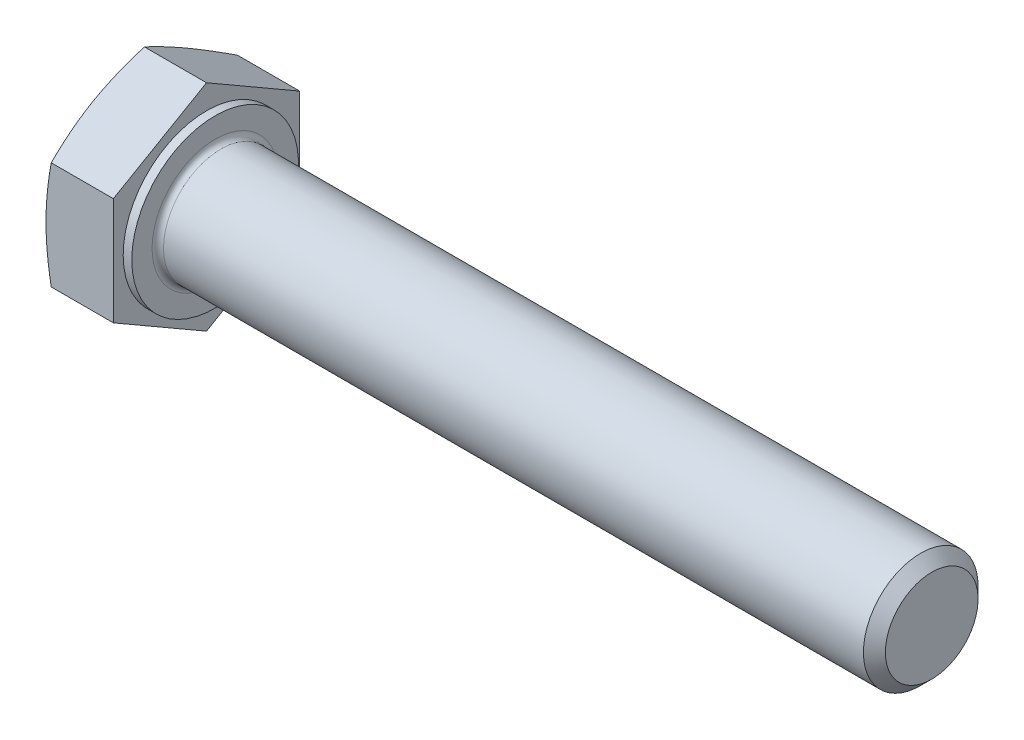
ISO-10303-21;
HEADER;
FILE_DESCRIPTION(('STEP AP214'),'2;1');
FILE_NAME('part.step','',(''),(''),'','','');
FILE_SCHEMA(('AUTOMOTIVE_DESIGN { 1 0 10303 214 1 1 1 1 }'));
ENDSEC;
DATA;
#1=APPLICATION_CONTEXT('core data for automotive mechanical design processes');
#2=APPLICATION_PROTOCOL_DEFINITION('international standard','automotive_design',2000,#1);
#3=PRODUCT_CONTEXT('',#1,'mechanical');
#4=PRODUCT('Part','Part','',(#3));
#5=PRODUCT_RELATED_PRODUCT_CATEGORY('part','',(#4));
#6=PRODUCT_DEFINITION_FORMATION('','',#4);
#7=PRODUCT_DEFINITION_CONTEXT('part definition',#1,'design');
#8=PRODUCT_DEFINITION('design','',#6,#7);
#9=PRODUCT_DEFINITION_SHAPE('','',#8);
#10=(LENGTH_UNIT() NAMED_UNIT(*) SI_UNIT(.MILLI.,.METRE.));
#11=(NAMED_UNIT(*) PLANE_ANGLE_UNIT() SI_UNIT($,.RADIAN.));
#12=(NAMED_UNIT(*) SI_UNIT($,.STERADIAN.) SOLID_ANGLE_UNIT());
#13=UNCERTAINTY_MEASURE_WITH_UNIT(LENGTH_MEASURE(1.E-05),#10,'distance_accuracy_value','');
#14=(GEOMETRIC_REPRESENTATION_CONTEXT(3) GLOBAL_UNCERTAINTY_ASSIGNED_CONTEXT((#13)) GLOBAL_UNIT_ASSIGNED_CONTEXT((#10,
#11,#12)) REPRESENTATION_CONTEXT('',''));
#15=CARTESIAN_POINT('',(0.,0.,0.));
#16=DIRECTION('',(0.,0.,1.));
#17=DIRECTION('',(1.,0.,0.));
#18=AXIS2_PLACEMENT_3D('',#15,#16,#17);
#19=CARTESIAN_POINT('',(-5.3,3.25,0.));
#20=DIRECTION('',(-1.,0.,0.));
#21=DIRECTION('',(0.,0.,1.));
#22=AXIS2_PLACEMENT_3D('',#19,#20,#21);
#23=PLANE('',#22);
#24=CARTESIAN_POINT('',(-5.30000000000191,0.,0.));
#25=DIRECTION('',(1.,0.,0.));
#26=DIRECTION('',(0.,0.,-1.));
#27=AXIS2_PLACEMENT_3D('',#24,#25,#26);
#28=CIRCLE('',#27,6.5000000000007);
#29=CARTESIAN_POINT('',(-5.30000000000204,0.,6.50000000000035));
#30=VERTEX_POINT('',#29);
#31=CARTESIAN_POINT('',(-5.30000000000204,-5.62916512459915,3.25000000000018));
#32=VERTEX_POINT('',#31);
#33=EDGE_CURVE('E90',#30,#32,#28,.T.);
#34=ORIENTED_EDGE('',*,*,#33,.F.);
#35=CARTESIAN_POINT('',(-5.30000000000191,0.,0.));
#36=DIRECTION('',(1.,0.,0.));
#37=DIRECTION('',(0.,0.,-1.));
#38=AXIS2_PLACEMENT_3D('',#35,#36,#37);
#39=CIRCLE('',#38,6.5000000000007);
#40=CARTESIAN_POINT('',(-5.30000000000204,5.62916512459915,3.25000000000017));
#41=VERTEX_POINT('',#40);
#42=EDGE_CURVE('E87',#41,#30,#39,.T.);
#43=ORIENTED_EDGE('',*,*,#42,.F.);
#44=CARTESIAN_POINT('',(-5.30000000000191,0.,0.));
#45=DIRECTION('',(1.,0.,0.));
#46=DIRECTION('',(0.,0.,-1.));
#47=AXIS2_PLACEMENT_3D('',#44,#45,#46);
#48=CIRCLE('',#47,6.5000000000007);
#49=CARTESIAN_POINT('',(-5.30000000000204,5.62916512459915,-3.25000000000018));
#50=VERTEX_POINT('',#49);
#51=EDGE_CURVE('E19',#50,#41,#48,.T.);
#52=ORIENTED_EDGE('',*,*,#51,.F.);
#53=CARTESIAN_POINT('',(-5.30000000000191,0.,0.));
#54=DIRECTION('',(1.,0.,0.));
#55=DIRECTION('',(0.,0.,-1.));
#56=AXIS2_PLACEMENT_3D('',#53,#54,#55);
#57=CIRCLE('',#56,6.5000000000007);
#58=CARTESIAN_POINT('',(-5.30000000000204,0.,-6.50000000000035));
#59=VERTEX_POINT('',#58);
#60=EDGE_CURVE('E494',#59,#50,#57,.T.);
#61=ORIENTED_EDGE('',*,*,#60,.F.);
#62=CARTESIAN_POINT('',(-5.30000000000191,0.,0.));
#63=DIRECTION('',(1.,0.,0.));
#64=DIRECTION('',(0.,0.,-1.));
#65=AXIS2_PLACEMENT_3D('',#62,#63,#64);
#66=CIRCLE('',#65,6.5000000000007);
#67=CARTESIAN_POINT('',(-5.30000000000204,-5.62916512459915,-3.25000000000017));
#68=VERTEX_POINT('',#67);
#69=EDGE_CURVE('E143',#68,#59,#66,.T.);
#70=ORIENTED_EDGE('',*,*,#69,.F.);
#71=CARTESIAN_POINT('',(-5.30000000000191,0.,0.));
#72=DIRECTION('',(1.,0.,0.));
#73=DIRECTION('',(0.,0.,-1.));
#74=AXIS2_PLACEMENT_3D('',#71,#72,#73);
#75=CIRCLE('',#74,6.5000000000007);
#76=EDGE_CURVE('E497',#32,#68,#75,.T.);
#77=ORIENTED_EDGE('',*,*,#76,.F.);
#78=EDGE_LOOP('',(#34,#43,#52,#61,#70,#77));
#79=FACE_BOUND('',#78,.T.);
#80=ADVANCED_FACE('F16',(#79),#23,.T.);
#81=CARTESIAN_POINT('',(-4.93181250797808,0.,0.));
#82=DIRECTION('',(1.,0.,0.));
#83=DIRECTION('',(0.,0.,-1.));
#84=AXIS2_PLACEMENT_3D('',#81,#82,#83);
#85=CONICAL_SURFACE('',#84,7.51158682046273,1.22173047639633);
#86=CARTESIAN_POINT('',(-4.9340084572349,7.50555349946536,3.81149567973056E-13));
#87=CARTESIAN_POINT('',(-4.99040133721858,7.35068182366044,-0.268245611147067));
#88=CARTESIAN_POINT('',(-5.04171341612011,7.1952901203805,-0.537391936302592));
#89=CARTESIAN_POINT('',(-5.13191353618944,6.88394451050351,-1.07665835132306));
#90=CARTESIAN_POINT('',(-5.17082716885483,6.72799244275547,-1.34677525620808));
#91=CARTESIAN_POINT('',(-5.21838013111644,6.493477197218,-1.75296757662848));
#92=CARTESIAN_POINT('',(-5.23243042665346,6.41518736692452,-1.88856954041273));
#93=CARTESIAN_POINT('',(-5.25670291998448,6.25845889501086,-2.16003121675981));
#94=CARTESIAN_POINT('',(-5.26692514592552,6.18002025448912,-2.2958909274201));
#95=CARTESIAN_POINT('',(-5.28337651284228,6.02287555891266,-2.56807352429847));
#96=CARTESIAN_POINT('',(-5.28959737705544,5.9441692859519,-2.7043967879409));
#97=CARTESIAN_POINT('',(-5.2979158402048,5.78669746743397,-2.97714597837422));
#98=CARTESIAN_POINT('',(-5.30001317614019,5.70793191841664,-3.11357191115829));
#99=CARTESIAN_POINT('',(-5.30000000000216,5.62916512459885,-3.25));
#100=B_SPLINE_CURVE_WITH_KNOTS('',3,(#86,#87,#88,#89,#90,#91,#92,#93,#94,#95,#96,#97,#98,#99),
.UNSPECIFIED.,.F.,.F.,(4,2,2,2,2,2,4),(0.,0.944644564579949,1.88732647361753,2.35891022619085,
2.8304905112329,3.3030431431734,3.77562591379344),.UNSPECIFIED.);
#101=CARTESIAN_POINT('',(-4.9340084572349,7.50555349946536,0.));
#102=VERTEX_POINT('',#101);
#103=EDGE_CURVE('E107',#102,#50,#100,.T.);
#104=ORIENTED_EDGE('',*,*,#103,.T.);
#105=ORIENTED_EDGE('',*,*,#51,.T.);
#106=CARTESIAN_POINT('',(-5.30000000000216,5.62916512459885,3.25));
#107=CARTESIAN_POINT('',(-5.30001317614019,5.70793191841664,3.11357191115829));
#108=CARTESIAN_POINT('',(-5.2979158402048,5.78669746743397,2.97714597837422));
#109=CARTESIAN_POINT('',(-5.28959737705544,5.9441692859519,2.7043967879409));
#110=CARTESIAN_POINT('',(-5.28337651284228,6.02287555891266,2.56807352429847));
#111=CARTESIAN_POINT('',(-5.26692514592552,6.18002025448912,2.2958909274201));
#112=CARTESIAN_POINT('',(-5.25670291998448,6.25845889501086,2.16003121675981));
#113=CARTESIAN_POINT('',(-5.23243042665346,6.41518736692452,1.88856954041273));
#114=CARTESIAN_POINT('',(-5.21838013111644,6.493477197218,1.75296757662847));
#115=CARTESIAN_POINT('',(-5.17082716885482,6.72799244275547,1.34677525620808));
#116=CARTESIAN_POINT('',(-5.13191353618944,6.88394451050351,1.07665835132306));
#117=CARTESIAN_POINT('',(-5.04171341612011,7.1952901203805,0.537391936302591));
#118=CARTESIAN_POINT('',(-4.99040133721858,7.35068182366044,0.268245611147065));
#119=CARTESIAN_POINT('',(-4.93400845723489,7.50555349946536,-3.822709621276E-13));
#120=B_SPLINE_CURVE_WITH_KNOTS('',3,(#106,#107,#108,#109,#110,#111,#112,#113,#114,#115,#116,
#117,#118,#119),.UNSPECIFIED.,.F.,.F.,(4,2,2,2,2,2,4),(0.,0.472582770620044,0.945135402560547,
1.4167156876026,1.88829944017592,2.83098134921349,3.77562591379344),.UNSPECIFIED.);
#121=EDGE_CURVE('E101',#41,#102,#120,.T.);
#122=ORIENTED_EDGE('',*,*,#121,.T.);
#123=EDGE_LOOP('',(#104,#105,#122));
#124=FACE_BOUND('',#123,.T.);
#125=ADVANCED_FACE('F105',(#124),#85,.T.);
#126=CARTESIAN_POINT('',(-4.93181250797808,0.,0.));
#127=DIRECTION('',(1.,0.,0.));
#128=DIRECTION('',(0.,0.,-1.));
#129=AXIS2_PLACEMENT_3D('',#126,#127,#128);
#130=CONICAL_SURFACE('',#129,7.51158682046273,1.22173047639633);
#131=CARTESIAN_POINT('',(-4.9340084572349,3.75277674973235,6.50000000000038));
#132=CARTESIAN_POINT('',(-4.99040133721858,3.90764842553726,6.23175438885293));
#133=CARTESIAN_POINT('',(-5.04171341612011,4.0630401288172,5.96260806369741));
#134=CARTESIAN_POINT('',(-5.13191353618944,4.37438573869419,5.42334164867694));
#135=CARTESIAN_POINT('',(-5.17082716885482,4.53033780644223,5.15322474379192));
#136=CARTESIAN_POINT('',(-5.21838013111644,4.7648530519797,4.74703242337153));
#137=CARTESIAN_POINT('',(-5.23243042665346,4.84314288227318,4.61143045958727));
#138=CARTESIAN_POINT('',(-5.25670291998448,4.99987135418684,4.33996878324019));
#139=CARTESIAN_POINT('',(-5.26692514592552,5.07830999470858,4.2041090725799));
#140=CARTESIAN_POINT('',(-5.28337651284228,5.23545469028504,3.93192647570153));
#141=CARTESIAN_POINT('',(-5.28959737705544,5.31416096324581,3.7956032120591));
#142=CARTESIAN_POINT('',(-5.2979158402048,5.47163278176374,3.52285402162578));
#143=CARTESIAN_POINT('',(-5.30001317614019,5.55039833078107,3.38642808884171));
#144=CARTESIAN_POINT('',(-5.30000000000216,5.62916512459885,3.25));
#145=B_SPLINE_CURVE_WITH_KNOTS('',3,(#131,#132,#133,#134,#135,#136,#137,#138,#139,#140,#141,
#142,#143,#144),.UNSPECIFIED.,.F.,.F.,(4,2,2,2,2,2,4),(0.,0.944644564579949,1.88732647361753,
2.35891022619085,2.8304905112329,3.3030431431734,3.77562591379344),.UNSPECIFIED.);
#146=CARTESIAN_POINT('',(-4.9340084572349,3.75277674973268,6.50000000000019));
#147=VERTEX_POINT('',#146);
#148=EDGE_CURVE('E95',#147,#41,#145,.T.);
#149=ORIENTED_EDGE('',*,*,#148,.T.);
#150=ORIENTED_EDGE('',*,*,#42,.T.);
#151=CARTESIAN_POINT('',(-5.30000000000216,0.,6.5));
#152=CARTESIAN_POINT('',(-5.30001317614019,0.157533587635573,6.5));
#153=CARTESIAN_POINT('',(-5.2979158402048,0.315064685670232,6.5));
#154=CARTESIAN_POINT('',(-5.28959737705544,0.630008322706093,6.5));
#155=CARTESIAN_POINT('',(-5.28337651284228,0.787420868627619,6.5));
#156=CARTESIAN_POINT('',(-5.26692514592552,1.10171025978054,6.5));
#157=CARTESIAN_POINT('',(-5.25670291998448,1.25858754082402,6.5));
#158=CARTESIAN_POINT('',(-5.23243042665346,1.57204448465133,6.5));
#159=CARTESIAN_POINT('',(-5.21838013111644,1.7286241452383,6.5));
#160=CARTESIAN_POINT('',(-5.17082716885482,2.19765463631324,6.5));
#161=CARTESIAN_POINT('',(-5.13191353618944,2.50955877180931,6.5));
#162=CARTESIAN_POINT('',(-5.04171341612011,3.1322499915633,6.5));
#163=CARTESIAN_POINT('',(-4.99040133721858,3.44303339812318,6.5));
#164=CARTESIAN_POINT('',(-4.9340084572349,3.75277674973301,6.5));
#165=B_SPLINE_CURVE_WITH_KNOTS('',3,(#151,#152,#153,#154,#155,#156,#157,#158,#159,#160,#161,
#162,#163,#164),.UNSPECIFIED.,.F.,.F.,(4,2,2,2,2,2,4),(0.,0.472582770620044,0.945135402560546,
1.4167156876026,1.88829944017592,2.83098134921349,3.77562591379344),.UNSPECIFIED.);
#166=EDGE_CURVE('E97',#30,#147,#165,.T.);
#167=ORIENTED_EDGE('',*,*,#166,.T.);
#168=EDGE_LOOP('',(#149,#150,#167));
#169=FACE_BOUND('',#168,.T.);
#170=ADVANCED_FACE('F96',(#169),#130,.T.);
#171=CARTESIAN_POINT('',(-4.93181250797808,0.,0.));
#172=DIRECTION('',(1.,0.,0.));
#173=DIRECTION('',(0.,0.,-1.));
#174=AXIS2_PLACEMENT_3D('',#171,#172,#173);
#175=CONICAL_SURFACE('',#174,7.51158682046273,1.22173047639633);
#176=CARTESIAN_POINT('',(-4.9340084572349,-3.75277674973301,6.5));
#177=CARTESIAN_POINT('',(-4.99040133721858,-3.44303339812318,6.5));
#178=CARTESIAN_POINT('',(-5.04171341612012,-3.13224999156329,6.5));
#179=CARTESIAN_POINT('',(-5.13191353618944,-2.50955877180931,6.5));
#180=CARTESIAN_POINT('',(-5.17082716885482,-2.19765463631324,6.5));
#181=CARTESIAN_POINT('',(-5.21838013111644,-1.7286241452383,6.5));
#182=CARTESIAN_POINT('',(-5.23243042665346,-1.57204448465133,6.5));
#183=CARTESIAN_POINT('',(-5.25670291998448,-1.25858754082402,6.5));
#184=CARTESIAN_POINT('',(-5.26692514592552,-1.10171025978054,6.5));
#185=CARTESIAN_POINT('',(-5.28337651284228,-0.787420868627618,6.5));
#186=CARTESIAN_POINT('',(-5.28959737705544,-0.630008322706092,6.5));
#187=CARTESIAN_POINT('',(-5.2979158402048,-0.315064685670231,6.5));
#188=CARTESIAN_POINT('',(-5.30001317614019,-0.157533587635572,6.5));
#189=CARTESIAN_POINT('',(-5.30000000000216,0.,6.5));
#190=B_SPLINE_CURVE_WITH_KNOTS('',3,(#176,#177,#178,#179,#180,#181,#182,#183,#184,#185,#186,
#187,#188,#189),.UNSPECIFIED.,.F.,.F.,(4,2,2,2,2,2,4),(0.,0.944644564579949,1.88732647361753,
2.35891022619085,2.8304905112329,3.3030431431734,3.77562591379344),.UNSPECIFIED.);
#191=CARTESIAN_POINT('',(-4.9340084572349,-3.75277674973268,6.50000000000019));
#192=VERTEX_POINT('',#191);
#193=EDGE_CURVE('E114',#192,#30,#190,.T.);
#194=ORIENTED_EDGE('',*,*,#193,.T.);
#195=ORIENTED_EDGE('',*,*,#33,.T.);
#196=CARTESIAN_POINT('',(-5.30000000000216,-5.62916512459885,3.25));
#197=CARTESIAN_POINT('',(-5.30001317614019,-5.55039833078106,3.38642808884171));
#198=CARTESIAN_POINT('',(-5.2979158402048,-5.47163278176373,3.52285402162578));
#199=CARTESIAN_POINT('',(-5.28959737705544,-5.3141609632458,3.7956032120591));
#200=CARTESIAN_POINT('',(-5.28337651284228,-5.23545469028504,3.93192647570153));
#201=CARTESIAN_POINT('',(-5.26692514592552,-5.07830999470858,4.2041090725799));
#202=CARTESIAN_POINT('',(-5.25670291998448,-4.99987135418684,4.33996878324019));
#203=CARTESIAN_POINT('',(-5.23243042665346,-4.84314288227318,4.61143045958727));
#204=CARTESIAN_POINT('',(-5.21838013111644,-4.7648530519797,4.74703242337153));
#205=CARTESIAN_POINT('',(-5.17082716885483,-4.53033780644223,5.15322474379192));
#206=CARTESIAN_POINT('',(-5.13191353618944,-4.37438573869419,5.42334164867694));
#207=CARTESIAN_POINT('',(-5.04171341612011,-4.0630401288172,5.96260806369741));
#208=CARTESIAN_POINT('',(-4.99040133721858,-3.90764842553726,6.23175438885294));
#209=CARTESIAN_POINT('',(-4.9340084572349,-3.75277674973235,6.50000000000038));
#210=B_SPLINE_CURVE_WITH_KNOTS('',3,(#196,#197,#198,#199,#200,#201,#202,#203,#204,#205,#206,
#207,#208,#209),.UNSPECIFIED.,.F.,.F.,(4,2,2,2,2,2,4),(0.,0.472582770620044,0.945135402560546,
1.4167156876026,1.88829944017592,2.83098134921349,3.77562591379344),.UNSPECIFIED.);
#211=EDGE_CURVE('E218',#32,#192,#210,.T.);
#212=ORIENTED_EDGE('',*,*,#211,.T.);
#213=EDGE_LOOP('',(#194,#195,#212));
#214=FACE_BOUND('',#213,.T.);
#215=ADVANCED_FACE('F208',(#214),#175,.T.);
#216=CARTESIAN_POINT('',(-4.93181250797808,0.,0.));
#217=DIRECTION('',(1.,0.,0.));
#218=DIRECTION('',(0.,0.,-1.));
#219=AXIS2_PLACEMENT_3D('',#216,#217,#218);
#220=CONICAL_SURFACE('',#219,7.51158682046273,1.22173047639633);
#221=ORIENTED_EDGE('',*,*,#76,.T.);
#222=CARTESIAN_POINT('',(-5.30000000000216,-5.62916512459885,-3.25));
#223=CARTESIAN_POINT('',(-5.30001317614019,-5.70793191841664,-3.11357191115829));
#224=CARTESIAN_POINT('',(-5.2979158402048,-5.78669746743397,-2.97714597837422));
#225=CARTESIAN_POINT('',(-5.28959737705544,-5.9441692859519,-2.7043967879409));
#226=CARTESIAN_POINT('',(-5.28337651284228,-6.02287555891266,-2.56807352429847));
#227=CARTESIAN_POINT('',(-5.26692514592552,-6.18002025448912,-2.2958909274201));
#228=CARTESIAN_POINT('',(-5.25670291998448,-6.25845889501086,-2.16003121675981));
#229=CARTESIAN_POINT('',(-5.23243042665346,-6.41518736692452,-1.88856954041273));
#230=CARTESIAN_POINT('',(-5.21838013111644,-6.493477197218,-1.75296757662847));
#231=CARTESIAN_POINT('',(-5.17082716885482,-6.72799244275547,-1.34677525620808));
#232=CARTESIAN_POINT('',(-5.13191353618944,-6.88394451050351,-1.07665835132306));
#233=CARTESIAN_POINT('',(-5.04171341612011,-7.1952901203805,-0.53739193630259));
#234=CARTESIAN_POINT('',(-4.99040133721858,-7.35068182366044,-0.268245611147065));
#235=CARTESIAN_POINT('',(-4.93400845723489,-7.50555349946536,3.8243163088973E-13));
#236=B_SPLINE_CURVE_WITH_KNOTS('',3,(#222,#223,#224,#225,#226,#227,#228,#229,#230,#231,#232,
#233,#234,#235),.UNSPECIFIED.,.F.,.F.,(4,2,2,2,2,2,4),(0.,0.472582770620044,0.945135402560546,
1.4167156876026,1.88829944017592,2.83098134921349,3.77562591379344),.UNSPECIFIED.);
#237=CARTESIAN_POINT('',(-4.9340084572349,-7.50555349946536,0.));
#238=VERTEX_POINT('',#237);
#239=EDGE_CURVE('E200',#68,#238,#236,.T.);
#240=ORIENTED_EDGE('',*,*,#239,.T.);
#241=CARTESIAN_POINT('',(-4.9340084572349,-7.50555349946536,-3.81088840357086E-13));
#242=CARTESIAN_POINT('',(-4.99040133721858,-7.35068182366044,0.268245611147067));
#243=CARTESIAN_POINT('',(-5.04171341612012,-7.1952901203805,0.537391936302592));
#244=CARTESIAN_POINT('',(-5.13191353618944,-6.88394451050351,1.07665835132306));
#245=CARTESIAN_POINT('',(-5.17082716885482,-6.72799244275547,1.34677525620808));
#246=CARTESIAN_POINT('',(-5.21838013111644,-6.493477197218,1.75296757662848));
#247=CARTESIAN_POINT('',(-5.23243042665346,-6.41518736692452,1.88856954041273));
#248=CARTESIAN_POINT('',(-5.25670291998448,-6.25845889501086,2.16003121675981));
#249=CARTESIAN_POINT('',(-5.26692514592552,-6.18002025448912,2.2958909274201));
#250=CARTESIAN_POINT('',(-5.28337651284228,-6.02287555891266,2.56807352429847));
#251=CARTESIAN_POINT('',(-5.28959737705544,-5.9441692859519,2.7043967879409));
#252=CARTESIAN_POINT('',(-5.2979158402048,-5.78669746743397,2.97714597837422));
#253=CARTESIAN_POINT('',(-5.30001317614019,-5.70793191841664,3.11357191115829));
#254=CARTESIAN_POINT('',(-5.30000000000216,-5.62916512459885,3.25));
#255=B_SPLINE_CURVE_WITH_KNOTS('',3,(#241,#242,#243,#244,#245,#246,#247,#248,#249,#250,#251,
#252,#253,#254),.UNSPECIFIED.,.F.,.F.,(4,2,2,2,2,2,4),(0.,0.944644564579949,1.88732647361753,
2.35891022619085,2.8304905112329,3.3030431431734,3.77562591379344),.UNSPECIFIED.);
#256=EDGE_CURVE('E213',#238,#32,#255,.T.);
#257=ORIENTED_EDGE('',*,*,#256,.T.);
#258=EDGE_LOOP('',(#221,#240,#257));
#259=FACE_BOUND('',#258,.T.);
#260=ADVANCED_FACE('F205',(#259),#220,.T.);
#261=CARTESIAN_POINT('',(-4.93181250797808,0.,0.));
#262=DIRECTION('',(1.,0.,0.));
#263=DIRECTION('',(0.,0.,-1.));
#264=AXIS2_PLACEMENT_3D('',#261,#262,#263);
#265=CONICAL_SURFACE('',#264,7.51158682046273,1.22173047639633);
#266=ORIENTED_EDGE('',*,*,#60,.T.);
#267=CARTESIAN_POINT('',(-5.30000000000216,5.62916512459885,-3.25));
#268=CARTESIAN_POINT('',(-5.30001317614019,5.55039833078106,-3.38642808884171));
#269=CARTESIAN_POINT('',(-5.2979158402048,5.47163278176373,-3.52285402162578));
#270=CARTESIAN_POINT('',(-5.28959737705544,5.3141609632458,-3.7956032120591));
#271=CARTESIAN_POINT('',(-5.28337651284228,5.23545469028504,-3.93192647570153));
#272=CARTESIAN_POINT('',(-5.26692514592552,5.07830999470858,-4.2041090725799));
#273=CARTESIAN_POINT('',(-5.25670291998448,4.99987135418684,-4.33996878324019));
#274=CARTESIAN_POINT('',(-5.23243042665346,4.84314288227318,-4.61143045958727));
#275=CARTESIAN_POINT('',(-5.21838013111644,4.7648530519797,-4.74703242337153));
#276=CARTESIAN_POINT('',(-5.17082716885483,4.53033780644223,-5.15322474379192));
#277=CARTESIAN_POINT('',(-5.13191353618944,4.37438573869419,-5.42334164867694));
#278=CARTESIAN_POINT('',(-5.04171341612011,4.0630401288172,-5.96260806369741));
#279=CARTESIAN_POINT('',(-4.99040133721858,3.90764842553726,-6.23175438885294));
#280=CARTESIAN_POINT('',(-4.9340084572349,3.75277674973235,-6.50000000000038));
#281=B_SPLINE_CURVE_WITH_KNOTS('',3,(#267,#268,#269,#270,#271,#272,#273,#274,#275,#276,#277,
#278,#279,#280),.UNSPECIFIED.,.F.,.F.,(4,2,2,2,2,2,4),(0.,0.472582770620044,0.945135402560546,
1.4167156876026,1.88829944017592,2.83098134921349,3.77562591379344),.UNSPECIFIED.);
#282=CARTESIAN_POINT('',(-4.93400845723494,3.75277674973246,-6.50000000000019));
#283=VERTEX_POINT('',#282);
#284=EDGE_CURVE('E102',#50,#283,#281,.T.);
#285=ORIENTED_EDGE('',*,*,#284,.T.);
#286=CARTESIAN_POINT('',(-4.9340084572349,3.75277674973301,-6.5));
#287=CARTESIAN_POINT('',(-4.99040133721858,3.44303339812318,-6.5));
#288=CARTESIAN_POINT('',(-5.04171341612011,3.1322499915633,-6.5));
#289=CARTESIAN_POINT('',(-5.13191353618944,2.50955877180931,-6.5));
#290=CARTESIAN_POINT('',(-5.17082716885483,2.19765463631324,-6.5));
#291=CARTESIAN_POINT('',(-5.21838013111644,1.72862414523829,-6.5));
#292=CARTESIAN_POINT('',(-5.23243042665346,1.57204448465133,-6.5));
#293=CARTESIAN_POINT('',(-5.25670291998448,1.25858754082402,-6.5));
#294=CARTESIAN_POINT('',(-5.26692514592552,1.10171025978054,-6.5));
#295=CARTESIAN_POINT('',(-5.28337651284228,0.787420868627618,-6.5));
#296=CARTESIAN_POINT('',(-5.28959737705544,0.630008322706091,-6.5));
#297=CARTESIAN_POINT('',(-5.2979158402048,0.31506468567023,-6.5));
#298=CARTESIAN_POINT('',(-5.30001317614019,0.157533587635571,-6.5));
#299=CARTESIAN_POINT('',(-5.30000000000216,0.,-6.5));
#300=B_SPLINE_CURVE_WITH_KNOTS('',3,(#286,#287,#288,#289,#290,#291,#292,#293,#294,#295,#296,
#297,#298,#299),.UNSPECIFIED.,.F.,.F.,(4,2,2,2,2,2,4),(0.,0.944644564579949,1.88732647361753,
2.35891022619085,2.8304905112329,3.3030431431734,3.77562591379344),.UNSPECIFIED.);
#301=EDGE_CURVE('E179',#283,#59,#300,.T.);
#302=ORIENTED_EDGE('',*,*,#301,.T.);
#303=EDGE_LOOP('',(#266,#285,#302));
#304=FACE_BOUND('',#303,.T.);
#305=ADVANCED_FACE('F158',(#304),#265,.T.);
#306=CARTESIAN_POINT('',(-4.93181250797808,0.,0.));
#307=DIRECTION('',(1.,0.,0.));
#308=DIRECTION('',(0.,0.,-1.));
#309=AXIS2_PLACEMENT_3D('',#306,#307,#308);
#310=CONICAL_SURFACE('',#309,7.51158682046273,1.22173047639633);
#311=ORIENTED_EDGE('',*,*,#69,.T.);
#312=CARTESIAN_POINT('',(-5.30000000000216,0.,-6.5));
#313=CARTESIAN_POINT('',(-5.30001317614019,-0.157533587635573,-6.5));
#314=CARTESIAN_POINT('',(-5.2979158402048,-0.315064685670233,-6.5));
#315=CARTESIAN_POINT('',(-5.28959737705544,-0.630008322706094,-6.5));
#316=CARTESIAN_POINT('',(-5.28337651284228,-0.78742086862762,-6.5));
#317=CARTESIAN_POINT('',(-5.26692514592552,-1.10171025978054,-6.5));
#318=CARTESIAN_POINT('',(-5.25670291998448,-1.25858754082402,-6.5));
#319=CARTESIAN_POINT('',(-5.23243042665346,-1.57204448465134,-6.5));
#320=CARTESIAN_POINT('',(-5.21838013111644,-1.7286241452383,-6.5));
#321=CARTESIAN_POINT('',(-5.17082716885482,-2.19765463631324,-6.5));
#322=CARTESIAN_POINT('',(-5.13191353618944,-2.50955877180932,-6.5));
#323=CARTESIAN_POINT('',(-5.04171341612011,-3.1322499915633,-6.5));
#324=CARTESIAN_POINT('',(-4.99040133721858,-3.44303339812318,-6.5));
#325=CARTESIAN_POINT('',(-4.9340084572349,-3.75277674973301,-6.5));
#326=B_SPLINE_CURVE_WITH_KNOTS('',3,(#312,#313,#314,#315,#316,#317,#318,#319,#320,#321,#322,
#323,#324,#325),.UNSPECIFIED.,.F.,.F.,(4,2,2,2,2,2,4),(0.,0.472582770620044,0.945135402560547,
1.4167156876026,1.88829944017592,2.83098134921349,3.77562591379344),.UNSPECIFIED.);
#327=CARTESIAN_POINT('',(-4.9340084572349,-3.75277674973268,-6.50000000000019));
#328=VERTEX_POINT('',#327);
#329=EDGE_CURVE('E172',#59,#328,#326,.T.);
#330=ORIENTED_EDGE('',*,*,#329,.T.);
#331=CARTESIAN_POINT('',(-4.9340084572349,-3.75277674973235,-6.50000000000038));
#332=CARTESIAN_POINT('',(-4.99040133721858,-3.90764842553726,-6.23175438885293));
#333=CARTESIAN_POINT('',(-5.04171341612012,-4.0630401288172,-5.96260806369741));
#334=CARTESIAN_POINT('',(-5.13191353618944,-4.37438573869419,-5.42334164867694));
#335=CARTESIAN_POINT('',(-5.17082716885482,-4.53033780644223,-5.15322474379192));
#336=CARTESIAN_POINT('',(-5.21838013111644,-4.7648530519797,-4.74703242337152));
#337=CARTESIAN_POINT('',(-5.23243042665346,-4.84314288227319,-4.61143045958727));
#338=CARTESIAN_POINT('',(-5.25670291998448,-4.99987135418684,-4.33996878324019));
#339=CARTESIAN_POINT('',(-5.26692514592552,-5.07830999470858,-4.2041090725799));
#340=CARTESIAN_POINT('',(-5.28337651284228,-5.23545469028504,-3.93192647570153));
#341=CARTESIAN_POINT('',(-5.28959737705544,-5.31416096324581,-3.7956032120591));
#342=CARTESIAN_POINT('',(-5.2979158402048,-5.47163278176374,-3.52285402162578));
#343=CARTESIAN_POINT('',(-5.30001317614019,-5.55039833078107,-3.38642808884171));
#344=CARTESIAN_POINT('',(-5.30000000000216,-5.62916512459885,-3.25));
#345=B_SPLINE_CURVE_WITH_KNOTS('',3,(#331,#332,#333,#334,#335,#336,#337,#338,#339,#340,#341,
#342,#343,#344),.UNSPECIFIED.,.F.,.F.,(4,2,2,2,2,2,4),(0.,0.944644564579949,1.88732647361753,
2.35891022619085,2.8304905112329,3.3030431431734,3.77562591379345),.UNSPECIFIED.);
#346=EDGE_CURVE('E164',#328,#68,#345,.T.);
#347=ORIENTED_EDGE('',*,*,#346,.T.);
#348=EDGE_LOOP('',(#311,#330,#347));
#349=FACE_BOUND('',#348,.T.);
#350=ADVANCED_FACE('F153',(#349),#310,.T.);
#351=CARTESIAN_POINT('',(0.,7.50555349946513,0.));
#352=DIRECTION('',(0.,-0.866025403784439,0.5));
#353=DIRECTION('',(0.,-0.5,-0.866025403784439));
#354=AXIS2_PLACEMENT_3D('',#351,#352,#353);
#355=PLANE('',#354);
#356=DIRECTION('',(1.,0.,0.));
#357=VECTOR('',#356,1.);
#358=CARTESIAN_POINT('',(0.,3.75277674973257,-6.5));
#359=LINE('',#358,#357);
#360=CARTESIAN_POINT('',(-0.6,3.75277674973257,-6.5));
#361=VERTEX_POINT('',#360);
#362=EDGE_CURVE('E337',#361,#283,#359,.F.);
#363=ORIENTED_EDGE('',*,*,#362,.T.);
#364=ORIENTED_EDGE('',*,*,#284,.F.);
#365=ORIENTED_EDGE('',*,*,#103,.F.);
#366=DIRECTION('',(1.,0.,0.));
#367=VECTOR('',#366,1.);
#368=CARTESIAN_POINT('',(0.,7.50555349946514,0.));
#369=LINE('',#368,#367);
#370=CARTESIAN_POINT('',(-0.6,7.50555349946513,0.));
#371=VERTEX_POINT('',#370);
#372=EDGE_CURVE('E112',#102,#371,#369,.T.);
#373=ORIENTED_EDGE('',*,*,#372,.T.);
#374=DIRECTION('',(0.,0.5,0.866025403784439));
#375=VECTOR('',#374,1.);
#376=CARTESIAN_POINT('',(-0.6,3.75277674973257,-6.5));
#377=LINE('',#376,#375);
#378=EDGE_CURVE('E302',#361,#371,#377,.T.);
#379=ORIENTED_EDGE('',*,*,#378,.F.);
#380=EDGE_LOOP('',(#363,#364,#365,#373,#379));
#381=FACE_BOUND('',#380,.T.);
#382=ADVANCED_FACE('F149',(#381),#355,.F.);
#383=CARTESIAN_POINT('',(0.,3.75277674973257,6.5));
#384=DIRECTION('',(0.,-0.866025403784439,-0.5));
#385=DIRECTION('',(0.,0.5,-0.866025403784439));
#386=AXIS2_PLACEMENT_3D('',#383,#384,#385);
#387=PLANE('',#386);
#388=ORIENTED_EDGE('',*,*,#372,.F.);
#389=ORIENTED_EDGE('',*,*,#121,.F.);
#390=ORIENTED_EDGE('',*,*,#148,.F.);
#391=DIRECTION('',(-1.,0.,0.));
#392=VECTOR('',#391,1.);
#393=CARTESIAN_POINT('',(0.,3.75277674973257,6.5));
#394=LINE('',#393,#392);
#395=CARTESIAN_POINT('',(-0.6,3.75277674973257,6.5));
#396=VERTEX_POINT('',#395);
#397=EDGE_CURVE('E219',#147,#396,#394,.F.);
#398=ORIENTED_EDGE('',*,*,#397,.T.);
#399=DIRECTION('',(0.,-0.5,0.866025403784439));
#400=VECTOR('',#399,1.);
#401=CARTESIAN_POINT('',(-0.6,7.50555349946513,0.));
#402=LINE('',#401,#400);
#403=EDGE_CURVE('E298',#371,#396,#402,.T.);
#404=ORIENTED_EDGE('',*,*,#403,.F.);
#405=EDGE_LOOP('',(#388,#389,#390,#398,#404));
#406=FACE_BOUND('',#405,.T.);
#407=ADVANCED_FACE('F110',(#406),#387,.F.);
#408=CARTESIAN_POINT('',(0.,-3.75277674973257,6.5));
#409=DIRECTION('',(0.,0.,-1.));
#410=DIRECTION('',(-1.,0.,0.));
#411=AXIS2_PLACEMENT_3D('',#408,#409,#410);
#412=PLANE('',#411);
#413=ORIENTED_EDGE('',*,*,#397,.F.);
#414=ORIENTED_EDGE('',*,*,#166,.F.);
#415=ORIENTED_EDGE('',*,*,#193,.F.);
#416=DIRECTION('',(1.,0.,0.));
#417=VECTOR('',#416,1.);
#418=CARTESIAN_POINT('',(0.,-3.75277674973257,6.5));
#419=LINE('',#418,#417);
#420=CARTESIAN_POINT('',(-0.6,-3.75277674973257,6.5));
#421=VERTEX_POINT('',#420);
#422=EDGE_CURVE('E332',#192,#421,#419,.T.);
#423=ORIENTED_EDGE('',*,*,#422,.T.);
#424=DIRECTION('',(0.,1.,0.));
#425=VECTOR('',#424,1.);
#426=CARTESIAN_POINT('',(-0.6,8.1075,6.5));
#427=LINE('',#426,#425);
#428=EDGE_CURVE('E301',#396,#421,#427,.F.);
#429=ORIENTED_EDGE('',*,*,#428,.F.);
#430=EDGE_LOOP('',(#413,#414,#415,#423,#429));
#431=FACE_BOUND('',#430,.T.);
#432=ADVANCED_FACE('F226',(#431),#412,.F.);
#433=CARTESIAN_POINT('',(0.,-7.50555349946513,0.));
#434=DIRECTION('',(0.,0.866025403784439,-0.5));
#435=DIRECTION('',(0.,0.5,0.866025403784439));
#436=AXIS2_PLACEMENT_3D('',#433,#434,#435);
#437=PLANE('',#436);
#438=ORIENTED_EDGE('',*,*,#422,.F.);
#439=ORIENTED_EDGE('',*,*,#211,.F.);
#440=ORIENTED_EDGE('',*,*,#256,.F.);
#441=DIRECTION('',(1.,0.,0.));
#442=VECTOR('',#441,1.);
#443=CARTESIAN_POINT('',(0.,-7.50555349946514,0.));
#444=LINE('',#443,#442);
#445=CARTESIAN_POINT('',(-0.6,-7.50555349946514,0.));
#446=VERTEX_POINT('',#445);
#447=EDGE_CURVE('E204',#238,#446,#444,.T.);
#448=ORIENTED_EDGE('',*,*,#447,.T.);
#449=DIRECTION('',(0.,-0.5,-0.866025403784439));
#450=VECTOR('',#449,1.);
#451=CARTESIAN_POINT('',(-0.6,-3.75277674973257,6.5));
#452=LINE('',#451,#450);
#453=EDGE_CURVE('E307',#421,#446,#452,.T.);
#454=ORIENTED_EDGE('',*,*,#453,.F.);
#455=EDGE_LOOP('',(#438,#439,#440,#448,#454));
#456=FACE_BOUND('',#455,.T.);
#457=ADVANCED_FACE('F197',(#456),#437,.F.);
#458=CARTESIAN_POINT('',(0.,-3.75277674973257,-6.5));
#459=DIRECTION('',(0.,0.866025403784439,0.5));
#460=DIRECTION('',(0.,-0.5,0.866025403784439));
#461=AXIS2_PLACEMENT_3D('',#458,#459,#460);
#462=PLANE('',#461);
#463=ORIENTED_EDGE('',*,*,#447,.F.);
#464=ORIENTED_EDGE('',*,*,#239,.F.);
#465=ORIENTED_EDGE('',*,*,#346,.F.);
#466=DIRECTION('',(1.,0.,0.));
#467=VECTOR('',#466,1.);
#468=CARTESIAN_POINT('',(0.,-3.75277674973257,-6.5));
#469=LINE('',#468,#467);
#470=CARTESIAN_POINT('',(-0.6,-3.75277674973257,-6.5));
#471=VERTEX_POINT('',#470);
#472=EDGE_CURVE('E34',#328,#471,#469,.T.);
#473=ORIENTED_EDGE('',*,*,#472,.T.);
#474=DIRECTION('',(0.,0.5,-0.866025403784439));
#475=VECTOR('',#474,1.);
#476=CARTESIAN_POINT('',(-0.6,-7.50555349946514,0.));
#477=LINE('',#476,#475);
#478=EDGE_CURVE('E312',#446,#471,#477,.T.);
#479=ORIENTED_EDGE('',*,*,#478,.F.);
#480=EDGE_LOOP('',(#463,#464,#465,#473,#479));
#481=FACE_BOUND('',#480,.T.);
#482=ADVANCED_FACE('F190',(#481),#462,.F.);
#483=CARTESIAN_POINT('',(0.,3.75277674973257,-6.5));
#484=DIRECTION('',(0.,0.,1.));
#485=DIRECTION('',(1.,0.,0.));
#486=AXIS2_PLACEMENT_3D('',#483,#484,#485);
#487=PLANE('',#486);
#488=ORIENTED_EDGE('',*,*,#472,.F.);
#489=ORIENTED_EDGE('',*,*,#329,.F.);
#490=ORIENTED_EDGE('',*,*,#301,.F.);
#491=ORIENTED_EDGE('',*,*,#362,.F.);
#492=DIRECTION('',(0.,1.,0.));
#493=VECTOR('',#492,1.);
#494=CARTESIAN_POINT('',(-0.6,8.1075,-6.5));
#495=LINE('',#494,#493);
#496=EDGE_CURVE('E294',#471,#361,#495,.T.);
#497=ORIENTED_EDGE('',*,*,#496,.F.);
#498=EDGE_LOOP('',(#488,#489,#490,#491,#497));
#499=FACE_BOUND('',#498,.T.);
#500=ADVANCED_FACE('F185',(#499),#487,.F.);
#501=CARTESIAN_POINT('',(-0.6,8.1075,0.));
#502=DIRECTION('',(1.,0.,0.));
#503=DIRECTION('',(0.,0.,-1.));
#504=AXIS2_PLACEMENT_3D('',#501,#502,#503);
#505=PLANE('',#504);
#506=CARTESIAN_POINT('',(-0.6,0.,0.));
#507=DIRECTION('',(-1.,0.,0.));
#508=DIRECTION('',(0.,0.,1.));
#509=AXIS2_PLACEMENT_3D('',#506,#507,#508);
#510=CIRCLE('',#509,5.815);
#511=CARTESIAN_POINT('',(-0.6,0.,5.815));
#512=VERTEX_POINT('',#511);
#513=EDGE_CURVE('E180',#512,#512,#510,.F.);
#514=ORIENTED_EDGE('',*,*,#513,.F.);
#515=EDGE_LOOP('',(#514));
#516=FACE_BOUND('',#515,.T.);
#517=ORIENTED_EDGE('',*,*,#478,.T.);
#518=ORIENTED_EDGE('',*,*,#496,.T.);
#519=ORIENTED_EDGE('',*,*,#378,.T.);
#520=ORIENTED_EDGE('',*,*,#403,.T.);
#521=ORIENTED_EDGE('',*,*,#428,.T.);
#522=ORIENTED_EDGE('',*,*,#453,.T.);
#523=EDGE_LOOP('',(#517,#518,#519,#520,#521,#522));
#524=FACE_BOUND('',#523,.T.);
#525=ADVANCED_FACE('F189',(#516,#524),#505,.T.);
#526=CARTESIAN_POINT('',(-0.3,0.,0.));
#527=DIRECTION('',(-1.,0.,0.));
#528=DIRECTION('',(0.,0.,1.));
#529=AXIS2_PLACEMENT_3D('',#526,#527,#528);
#530=CYLINDRICAL_SURFACE('',#529,5.815);
#531=ORIENTED_EDGE('',*,*,#513,.T.);
#532=EDGE_LOOP('',(#531));
#533=FACE_BOUND('',#532,.T.);
#534=CARTESIAN_POINT('',(0.,0.,0.));
#535=DIRECTION('',(-1.,0.,0.));
#536=DIRECTION('',(0.,0.,1.));
#537=AXIS2_PLACEMENT_3D('',#534,#535,#536);
#538=CIRCLE('',#537,5.815);
#539=CARTESIAN_POINT('',(0.,0.,5.815));
#540=VERTEX_POINT('',#539);
#541=EDGE_CURVE('E289',#540,#540,#538,.F.);
#542=ORIENTED_EDGE('',*,*,#541,.F.);
#543=EDGE_LOOP('',(#542));
#544=FACE_BOUND('',#543,.T.);
#545=ADVANCED_FACE('F276',(#533,#544),#530,.T.);
#546=CARTESIAN_POINT('',(50.,1.6165,0.));
#547=DIRECTION('',(1.,0.,0.));
#548=DIRECTION('',(0.,0.,-1.));
#549=AXIS2_PLACEMENT_3D('',#546,#547,#548);
#550=PLANE('',#549);
#551=CARTESIAN_POINT('',(50.0000000000114,0.,0.));
#552=DIRECTION('',(-1.,0.,0.));
#553=DIRECTION('',(0.,0.,1.));
#554=AXIS2_PLACEMENT_3D('',#551,#552,#553);
#555=CIRCLE('',#554,3.23300000007976);
#556=CARTESIAN_POINT('',(50.0000000000114,0.,3.23300000007976));
#557=VERTEX_POINT('',#556);
#558=EDGE_CURVE('E291',#557,#557,#555,.T.);
#559=ORIENTED_EDGE('',*,*,#558,.F.);
#560=EDGE_LOOP('',(#559));
#561=FACE_BOUND('',#560,.T.);
#562=ADVANCED_FACE('F274',(#561),#550,.T.);
#563=CARTESIAN_POINT('',(0.,5.1075,0.));
#564=DIRECTION('',(1.,0.,0.));
#565=DIRECTION('',(0.,0.,-1.));
#566=AXIS2_PLACEMENT_3D('',#563,#564,#565);
#567=PLANE('',#566);
#568=CARTESIAN_POINT('',(0.,0.,0.));
#569=DIRECTION('',(1.,0.,0.));
#570=DIRECTION('',(0.,1.,0.));
#571=AXIS2_PLACEMENT_3D('',#568,#569,#570);
#572=CIRCLE('',#571,4.39999999999999);
#573=CARTESIAN_POINT('',(0.,4.39999999999999,0.));
#574=VERTEX_POINT('',#573);
#575=EDGE_CURVE('E261',#574,#574,#572,.T.);
#576=ORIENTED_EDGE('',*,*,#575,.F.);
#577=EDGE_LOOP('',(#576));
#578=FACE_BOUND('',#577,.T.);
#579=ORIENTED_EDGE('',*,*,#541,.T.);
#580=EDGE_LOOP('',(#579));
#581=FACE_BOUND('',#580,.T.);
#582=ADVANCED_FACE('F265',(#578,#581),#567,.T.);
#583=CARTESIAN_POINT('',(49.233000000072,0.,0.));
#584=DIRECTION('',(-1.,0.,0.));
#585=DIRECTION('',(0.,0.,1.));
#586=AXIS2_PLACEMENT_3D('',#583,#584,#585);
#587=CONICAL_SURFACE('',#586,4.0000000000191,0.785398163397448);
#588=ORIENTED_EDGE('',*,*,#558,.T.);
#589=EDGE_LOOP('',(#588));
#590=FACE_BOUND('',#589,.T.);
#591=CARTESIAN_POINT('',(49.233,0.,0.));
#592=DIRECTION('',(-1.,0.,0.));
#593=DIRECTION('',(0.,0.,1.));
#594=AXIS2_PLACEMENT_3D('',#591,#592,#593);
#595=CIRCLE('',#594,4.);
#596=CARTESIAN_POINT('',(49.233,0.,4.));
#597=VERTEX_POINT('',#596);
#598=EDGE_CURVE('E25',#597,#597,#595,.T.);
#599=ORIENTED_EDGE('',*,*,#598,.F.);
#600=EDGE_LOOP('',(#599));
#601=FACE_BOUND('',#600,.T.);
#602=ADVANCED_FACE('F245',(#590,#601),#587,.T.);
#603=CARTESIAN_POINT('',(0.399999999999986,0.,0.));
#604=DIRECTION('',(-1.,0.,0.));
#605=DIRECTION('',(0.,0.,1.));
#606=AXIS2_PLACEMENT_3D('',#603,#604,#605);
#607=TOROIDAL_SURFACE('',#606,4.39999999999999,0.399999999999986);
#608=CARTESIAN_POINT('',(0.400000000000001,0.,0.));
#609=DIRECTION('',(-1.,0.,0.));
#610=DIRECTION('',(0.,0.,1.));
#611=AXIS2_PLACEMENT_3D('',#608,#609,#610);
#612=CIRCLE('',#611,4.);
#613=CARTESIAN_POINT('',(0.400000000000001,0.,4.));
#614=VERTEX_POINT('',#613);
#615=EDGE_CURVE('E10',#614,#614,#612,.F.);
#616=ORIENTED_EDGE('',*,*,#615,.F.);
#617=EDGE_LOOP('',(#616));
#618=FACE_BOUND('',#617,.T.);
#619=ORIENTED_EDGE('',*,*,#575,.T.);
#620=EDGE_LOOP('',(#619));
#621=FACE_BOUND('',#620,.T.);
#622=ADVANCED_FACE('F239',(#618,#621),#607,.F.);
#623=CARTESIAN_POINT('',(24.8165,0.,0.));
#624=DIRECTION('',(-1.,0.,0.));
#625=DIRECTION('',(0.,0.,1.));
#626=AXIS2_PLACEMENT_3D('',#623,#624,#625);
#627=CYLINDRICAL_SURFACE('',#626,4.);
#628=ORIENTED_EDGE('',*,*,#598,.T.);
#629=EDGE_LOOP('',(#628));
#630=FACE_BOUND('',#629,.T.);
#631=ORIENTED_EDGE('',*,*,#615,.T.);
#632=EDGE_LOOP('',(#631));
#633=FACE_BOUND('',#632,.T.);
#634=ADVANCED_FACE('F237',(#630,#633),#627,.T.);
#635=CLOSED_SHELL('',(#80,#125,#170,#215,#260,#305,#350,#382,#407,#432,#457,#482,#500,#525,#545,
#562,#582,#602,#622,#634));
#636=MANIFOLD_SOLID_BREP('B1',#635);
#637=ADVANCED_BREP_SHAPE_REPRESENTATION('',(#18,#636),#14);
#638=SHAPE_DEFINITION_REPRESENTATION(#9,#637);
ENDSEC;
END-ISO-10303-21;
